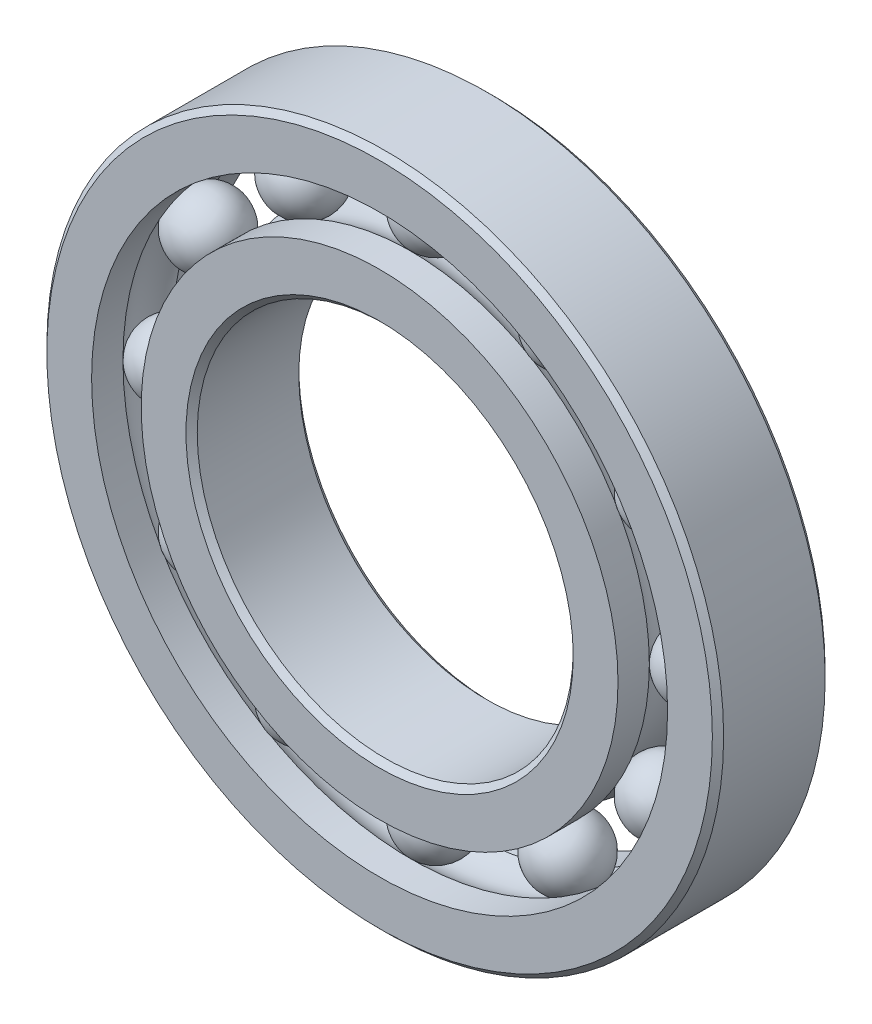
ISO-10303-21;
HEADER;
FILE_DESCRIPTION(('STEP AP214'),'2;1');
FILE_NAME('part.step','',(''),(''),'','','');
FILE_SCHEMA(('AUTOMOTIVE_DESIGN { 1 0 10303 214 1 1 1 1 }'));
ENDSEC;
DATA;
#1=APPLICATION_CONTEXT('core data for automotive mechanical design processes');
#2=APPLICATION_PROTOCOL_DEFINITION('international standard','automotive_design',2000,#1);
#3=PRODUCT_CONTEXT('',#1,'mechanical');
#4=PRODUCT('Part','Part','',(#3));
#5=PRODUCT_RELATED_PRODUCT_CATEGORY('part','',(#4));
#6=PRODUCT_DEFINITION_FORMATION('','',#4);
#7=PRODUCT_DEFINITION_CONTEXT('part definition',#1,'design');
#8=PRODUCT_DEFINITION('design','',#6,#7);
#9=PRODUCT_DEFINITION_SHAPE('','',#8);
#10=(LENGTH_UNIT() NAMED_UNIT(*) SI_UNIT(.MILLI.,.METRE.));
#11=(NAMED_UNIT(*) PLANE_ANGLE_UNIT() SI_UNIT($,.RADIAN.));
#12=(NAMED_UNIT(*) SI_UNIT($,.STERADIAN.) SOLID_ANGLE_UNIT());
#13=UNCERTAINTY_MEASURE_WITH_UNIT(LENGTH_MEASURE(1.E-05),#10,'distance_accuracy_value','');
#14=(GEOMETRIC_REPRESENTATION_CONTEXT(3) GLOBAL_UNCERTAINTY_ASSIGNED_CONTEXT((#13)) GLOBAL_UNIT_ASSIGNED_CONTEXT((#10,
#11,#12)) REPRESENTATION_CONTEXT('',''));
#15=CARTESIAN_POINT('',(0.,0.,0.));
#16=DIRECTION('',(0.,0.,1.));
#17=DIRECTION('',(1.,0.,0.));
#18=AXIS2_PLACEMENT_3D('',#15,#16,#17);
#19=CARTESIAN_POINT('',(-11.1124999999998,19.2474145991093,0.));
#20=DIRECTION('',(0.,0.,1.));
#21=DIRECTION('',(-0.499999999999989,0.866025403784445,0.));
#22=AXIS2_PLACEMENT_3D('',#19,#20,#21);
#23=SPHERICAL_SURFACE('',#22,2.97701678582704);
#24=CARTESIAN_POINT('',(-11.1124999999998,19.2474145991093,2.97701678582704));
#25=VERTEX_POINT('',#24);
#26=VERTEX_LOOP('',#25);
#27=FACE_BOUND('',#26,.T.);
#28=ADVANCED_FACE('F37',(#27),#23,.T.);
#29=CLOSED_SHELL('',(#28));
#30=MANIFOLD_SOLID_BREP('B2',#29);
#31=CARTESIAN_POINT('',(-19.247414599109,11.1125000000002,0.));
#32=DIRECTION('',(0.,0.,1.));
#33=DIRECTION('',(-0.866025403784433,0.50000000000001,0.));
#34=AXIS2_PLACEMENT_3D('',#31,#32,#33);
#35=SPHERICAL_SURFACE('',#34,2.97701678582704);
#36=CARTESIAN_POINT('',(-19.247414599109,11.1125000000002,2.97701678582704));
#37=VERTEX_POINT('',#36);
#38=VERTEX_LOOP('',#37);
#39=FACE_BOUND('',#38,.T.);
#40=ADVANCED_FACE('F57',(#39),#35,.T.);
#41=CLOSED_SHELL('',(#40));
#42=MANIFOLD_SOLID_BREP('B6',#41);
#43=CARTESIAN_POINT('',(-22.225,2.32794518267366E-13,0.));
#44=DIRECTION('',(0.,0.,1.));
#45=DIRECTION('',(-1.,0.,0.));
#46=AXIS2_PLACEMENT_3D('',#43,#44,#45);
#47=SPHERICAL_SURFACE('',#46,2.97701678582704);
#48=CARTESIAN_POINT('',(-22.225,2.32794518267366E-13,2.97701678582704));
#49=VERTEX_POINT('',#48);
#50=VERTEX_LOOP('',#49);
#51=FACE_BOUND('',#50,.T.);
#52=ADVANCED_FACE('F77',(#51),#47,.T.);
#53=CLOSED_SHELL('',(#52));
#54=MANIFOLD_SOLID_BREP('B33',#53);
#55=CARTESIAN_POINT('',(-19.2474145991093,-11.1124999999998,0.));
#56=DIRECTION('',(0.,0.,1.));
#57=DIRECTION('',(-0.866025403784443,-0.499999999999992,0.));
#58=AXIS2_PLACEMENT_3D('',#55,#56,#57);
#59=SPHERICAL_SURFACE('',#58,2.97701678582704);
#60=CARTESIAN_POINT('',(-19.2474145991093,-11.1124999999998,2.97701678582704));
#61=VERTEX_POINT('',#60);
#62=VERTEX_LOOP('',#61);
#63=FACE_BOUND('',#62,.T.);
#64=ADVANCED_FACE('F97',(#63),#59,.T.);
#65=CLOSED_SHELL('',(#64));
#66=MANIFOLD_SOLID_BREP('B53',#65);
#67=CARTESIAN_POINT('',(-11.1125000000002,-19.2474145991091,0.));
#68=DIRECTION('',(0.,0.,1.));
#69=DIRECTION('',(-0.500000000000007,-0.866025403784435,0.));
#70=AXIS2_PLACEMENT_3D('',#67,#68,#69);
#71=SPHERICAL_SURFACE('',#70,2.97701678582704);
#72=CARTESIAN_POINT('',(-11.1125000000002,-19.2474145991091,2.97701678582704));
#73=VERTEX_POINT('',#72);
#74=VERTEX_LOOP('',#73);
#75=FACE_BOUND('',#74,.T.);
#76=ADVANCED_FACE('F117',(#75),#71,.T.);
#77=CLOSED_SHELL('',(#76));
#78=MANIFOLD_SOLID_BREP('B73',#77);
#79=CARTESIAN_POINT('',(-1.55196345511577E-13,-22.225,0.));
#80=DIRECTION('',(0.,0.,1.));
#81=DIRECTION('',(0.,-1.,0.));
#82=AXIS2_PLACEMENT_3D('',#79,#80,#81);
#83=SPHERICAL_SURFACE('',#82,2.97701678582704);
#84=CARTESIAN_POINT('',(-1.55196345511577E-13,-22.225,2.97701678582704));
#85=VERTEX_POINT('',#84);
#86=VERTEX_LOOP('',#85);
#87=FACE_BOUND('',#86,.T.);
#88=ADVANCED_FACE('F137',(#87),#83,.T.);
#89=CLOSED_SHELL('',(#88));
#90=MANIFOLD_SOLID_BREP('B93',#89);
#91=CARTESIAN_POINT('',(11.1124999999999,-19.2474145991092,0.));
#92=DIRECTION('',(0.,0.,1.));
#93=DIRECTION('',(0.499999999999995,-0.866025403784442,0.));
#94=AXIS2_PLACEMENT_3D('',#91,#92,#93);
#95=SPHERICAL_SURFACE('',#94,2.97701678582704);
#96=CARTESIAN_POINT('',(11.1124999999999,-19.2474145991092,2.97701678582704));
#97=VERTEX_POINT('',#96);
#98=VERTEX_LOOP('',#97);
#99=FACE_BOUND('',#98,.T.);
#100=ADVANCED_FACE('F157',(#99),#95,.T.);
#101=CLOSED_SHELL('',(#100));
#102=MANIFOLD_SOLID_BREP('B113',#101);
#103=CARTESIAN_POINT('',(19.2474145991091,-11.1125000000001,0.));
#104=DIRECTION('',(0.,0.,1.));
#105=DIRECTION('',(0.866025403784436,-0.500000000000004,0.));
#106=AXIS2_PLACEMENT_3D('',#103,#104,#105);
#107=SPHERICAL_SURFACE('',#106,2.97701678582704);
#108=CARTESIAN_POINT('',(19.2474145991091,-11.1125000000001,2.97701678582704));
#109=VERTEX_POINT('',#108);
#110=VERTEX_LOOP('',#109);
#111=FACE_BOUND('',#110,.T.);
#112=ADVANCED_FACE('F177',(#111),#107,.T.);
#113=CLOSED_SHELL('',(#112));
#114=MANIFOLD_SOLID_BREP('B133',#113);
#115=CARTESIAN_POINT('',(22.225,0.,0.));
#116=DIRECTION('',(0.,0.,1.));
#117=DIRECTION('',(1.,0.,0.));
#118=AXIS2_PLACEMENT_3D('',#115,#116,#117);
#119=SPHERICAL_SURFACE('',#118,2.97701678582704);
#120=CARTESIAN_POINT('',(22.225,0.,2.97701678582704));
#121=VERTEX_POINT('',#120);
#122=VERTEX_LOOP('',#121);
#123=FACE_BOUND('',#122,.T.);
#124=ADVANCED_FACE('F197',(#123),#119,.T.);
#125=CLOSED_SHELL('',(#124));
#126=MANIFOLD_SOLID_BREP('B153',#125);
#127=CARTESIAN_POINT('',(19.2474145991092,11.1125,0.));
#128=DIRECTION('',(0.,0.,1.));
#129=DIRECTION('',(0.86602540378444,0.499999999999998,0.));
#130=AXIS2_PLACEMENT_3D('',#127,#128,#129);
#131=SPHERICAL_SURFACE('',#130,2.97701678582704);
#132=CARTESIAN_POINT('',(19.2474145991092,11.1125,2.97701678582704));
#133=VERTEX_POINT('',#132);
#134=VERTEX_LOOP('',#133);
#135=FACE_BOUND('',#134,.T.);
#136=ADVANCED_FACE('F217',(#135),#131,.T.);
#137=CLOSED_SHELL('',(#136));
#138=MANIFOLD_SOLID_BREP('B173',#137);
#139=CARTESIAN_POINT('',(11.1125,19.2474145991091,0.));
#140=DIRECTION('',(0.,0.,1.));
#141=DIRECTION('',(0.500000000000001,0.866025403784438,0.));
#142=AXIS2_PLACEMENT_3D('',#139,#140,#141);
#143=SPHERICAL_SURFACE('',#142,2.97701678582704);
#144=CARTESIAN_POINT('',(11.1125,19.2474145991091,2.97701678582704));
#145=VERTEX_POINT('',#144);
#146=VERTEX_LOOP('',#145);
#147=FACE_BOUND('',#146,.T.);
#148=ADVANCED_FACE('F237',(#147),#143,.T.);
#149=CLOSED_SHELL('',(#148));
#150=MANIFOLD_SOLID_BREP('B193',#149);
#151=CARTESIAN_POINT('',(0.,22.225,0.));
#152=DIRECTION('',(0.,0.,1.));
#153=DIRECTION('',(0.,1.,0.));
#154=AXIS2_PLACEMENT_3D('',#151,#152,#153);
#155=SPHERICAL_SURFACE('',#154,2.97701678582704);
#156=CARTESIAN_POINT('',(0.,22.225,2.97701678582704));
#157=VERTEX_POINT('',#156);
#158=VERTEX_LOOP('',#157);
#159=FACE_BOUND('',#158,.T.);
#160=ADVANCED_FACE('F259',(#159),#155,.T.);
#161=CLOSED_SHELL('',(#160));
#162=MANIFOLD_SOLID_BREP('B213',#161);
#163=CARTESIAN_POINT('',(0.,20.1315934065934,4.7625));
#164=DIRECTION('',(0.,0.,-1.));
#165=DIRECTION('',(-1.,0.,0.));
#166=AXIS2_PLACEMENT_3D('',#163,#164,#165);
#167=PLANE('',#166);
#168=CARTESIAN_POINT('',(0.,0.,4.7625));
#169=DIRECTION('',(0.,0.,1.));
#170=DIRECTION('',(1.,0.,0.));
#171=AXIS2_PLACEMENT_3D('',#168,#169,#170);
#172=CIRCLE('',#171,16.35125);
#173=CARTESIAN_POINT('',(16.35125,0.,4.7625));
#174=VERTEX_POINT('',#173);
#175=EDGE_CURVE('E306',#174,#174,#172,.T.);
#176=ORIENTED_EDGE('',*,*,#175,.F.);
#177=EDGE_LOOP('',(#176));
#178=FACE_BOUND('',#177,.T.);
#179=CARTESIAN_POINT('',(0.,0.,4.76250000000001));
#180=DIRECTION('',(0.,0.,1.));
#181=DIRECTION('',(1.,0.,0.));
#182=AXIS2_PLACEMENT_3D('',#179,#180,#181);
#183=CIRCLE('',#182,20.1315934065934);
#184=CARTESIAN_POINT('',(20.1315934065934,0.,4.76250000000001));
#185=VERTEX_POINT('',#184);
#186=EDGE_CURVE('E258',#185,#185,#183,.T.);
#187=ORIENTED_EDGE('',*,*,#186,.T.);
#188=EDGE_LOOP('',(#187));
#189=FACE_BOUND('',#188,.T.);
#190=ADVANCED_FACE('F278',(#178,#189),#167,.F.);
#191=CARTESIAN_POINT('',(0.,0.,4.7625));
#192=DIRECTION('',(0.,0.,1.));
#193=DIRECTION('',(1.,0.,0.));
#194=AXIS2_PLACEMENT_3D('',#191,#192,#193);
#195=CYLINDRICAL_SURFACE('',#194,20.1315934065934);
#196=ORIENTED_EDGE('',*,*,#186,.F.);
#197=EDGE_LOOP('',(#196));
#198=FACE_BOUND('',#197,.T.);
#199=CARTESIAN_POINT('',(0.,0.,2.11666666666667));
#200=DIRECTION('',(0.,0.,1.));
#201=DIRECTION('',(1.,0.,0.));
#202=AXIS2_PLACEMENT_3D('',#199,#200,#201);
#203=CIRCLE('',#202,20.1315934065934);
#204=CARTESIAN_POINT('',(20.1315934065934,0.,2.11666666666667));
#205=VERTEX_POINT('',#204);
#206=EDGE_CURVE('E284',#205,#205,#203,.T.);
#207=ORIENTED_EDGE('',*,*,#206,.T.);
#208=EDGE_LOOP('',(#207));
#209=FACE_BOUND('',#208,.T.);
#210=ADVANCED_FACE('F313',(#198,#209),#195,.T.);
#211=CARTESIAN_POINT('',(0.,0.,0.));
#212=DIRECTION('',(0.,0.,1.));
#213=DIRECTION('',(1.,0.,0.));
#214=AXIS2_PLACEMENT_3D('',#211,#212,#213);
#215=TOROIDAL_SURFACE('',#214,22.225,2.97701678582704);
#216=ORIENTED_EDGE('',*,*,#206,.F.);
#217=EDGE_LOOP('',(#216));
#218=FACE_BOUND('',#217,.T.);
#219=CARTESIAN_POINT('',(0.,0.,-2.11666666666667));
#220=DIRECTION('',(0.,0.,1.));
#221=DIRECTION('',(1.,0.,0.));
#222=AXIS2_PLACEMENT_3D('',#219,#220,#221);
#223=CIRCLE('',#222,20.1315934065934);
#224=CARTESIAN_POINT('',(20.1315934065934,0.,-2.11666666666667));
#225=VERTEX_POINT('',#224);
#226=EDGE_CURVE('E288',#225,#225,#223,.T.);
#227=ORIENTED_EDGE('',*,*,#226,.T.);
#228=EDGE_LOOP('',(#227));
#229=FACE_BOUND('',#228,.T.);
#230=ADVANCED_FACE('F317',(#218,#229),#215,.F.);
#231=CARTESIAN_POINT('',(0.,0.,4.7625));
#232=DIRECTION('',(0.,0.,1.));
#233=DIRECTION('',(1.,0.,0.));
#234=AXIS2_PLACEMENT_3D('',#231,#232,#233);
#235=CYLINDRICAL_SURFACE('',#234,20.1315934065934);
#236=ORIENTED_EDGE('',*,*,#226,.F.);
#237=EDGE_LOOP('',(#236));
#238=FACE_BOUND('',#237,.T.);
#239=CARTESIAN_POINT('',(0.,0.,-4.76250000000001));
#240=DIRECTION('',(0.,0.,1.));
#241=DIRECTION('',(1.,0.,0.));
#242=AXIS2_PLACEMENT_3D('',#239,#240,#241);
#243=CIRCLE('',#242,20.1315934065934);
#244=CARTESIAN_POINT('',(20.1315934065934,0.,-4.76250000000001));
#245=VERTEX_POINT('',#244);
#246=EDGE_CURVE('E292',#245,#245,#243,.T.);
#247=ORIENTED_EDGE('',*,*,#246,.T.);
#248=EDGE_LOOP('',(#247));
#249=FACE_BOUND('',#248,.T.);
#250=ADVANCED_FACE('F322',(#238,#249),#235,.T.);
#251=CARTESIAN_POINT('',(0.,16.35125,-4.7625));
#252=DIRECTION('',(0.,0.,1.));
#253=DIRECTION('',(1.,0.,0.));
#254=AXIS2_PLACEMENT_3D('',#251,#252,#253);
#255=PLANE('',#254);
#256=ORIENTED_EDGE('',*,*,#246,.F.);
#257=EDGE_LOOP('',(#256));
#258=FACE_BOUND('',#257,.T.);
#259=CARTESIAN_POINT('',(0.,0.,-4.7625));
#260=DIRECTION('',(0.,0.,1.));
#261=DIRECTION('',(1.,0.,0.));
#262=AXIS2_PLACEMENT_3D('',#259,#260,#261);
#263=CIRCLE('',#262,16.35125);
#264=CARTESIAN_POINT('',(16.35125,0.,-4.7625));
#265=VERTEX_POINT('',#264);
#266=EDGE_CURVE('E297',#265,#265,#263,.T.);
#267=ORIENTED_EDGE('',*,*,#266,.T.);
#268=EDGE_LOOP('',(#267));
#269=FACE_BOUND('',#268,.T.);
#270=ADVANCED_FACE('F328',(#258,#269),#255,.F.);
#271=CARTESIAN_POINT('',(0.,0.,-4.28625));
#272=DIRECTION('',(0.,0.,-1.));
#273=DIRECTION('',(-1.,0.,0.));
#274=AXIS2_PLACEMENT_3D('',#271,#272,#273);
#275=CONICAL_SURFACE('',#274,15.875,0.785398163397447);
#276=ORIENTED_EDGE('',*,*,#266,.F.);
#277=EDGE_LOOP('',(#276));
#278=FACE_BOUND('',#277,.T.);
#279=CARTESIAN_POINT('',(0.,0.,-4.28625));
#280=DIRECTION('',(0.,0.,1.));
#281=DIRECTION('',(1.,0.,0.));
#282=AXIS2_PLACEMENT_3D('',#279,#280,#281);
#283=CIRCLE('',#282,15.875);
#284=CARTESIAN_POINT('',(15.875,0.,-4.28625));
#285=VERTEX_POINT('',#284);
#286=EDGE_CURVE('E300',#285,#285,#283,.T.);
#287=ORIENTED_EDGE('',*,*,#286,.T.);
#288=EDGE_LOOP('',(#287));
#289=FACE_BOUND('',#288,.T.);
#290=ADVANCED_FACE('F332',(#278,#289),#275,.F.);
#291=CARTESIAN_POINT('',(0.,0.,4.7625));
#292=DIRECTION('',(0.,0.,1.));
#293=DIRECTION('',(1.,0.,0.));
#294=AXIS2_PLACEMENT_3D('',#291,#292,#293);
#295=CYLINDRICAL_SURFACE('',#294,15.875);
#296=ORIENTED_EDGE('',*,*,#286,.F.);
#297=EDGE_LOOP('',(#296));
#298=FACE_BOUND('',#297,.T.);
#299=CARTESIAN_POINT('',(0.,0.,4.28625000000001));
#300=DIRECTION('',(0.,0.,1.));
#301=DIRECTION('',(1.,0.,0.));
#302=AXIS2_PLACEMENT_3D('',#299,#300,#301);
#303=CIRCLE('',#302,15.875);
#304=CARTESIAN_POINT('',(15.875,0.,4.28625000000001));
#305=VERTEX_POINT('',#304);
#306=EDGE_CURVE('E303',#305,#305,#303,.T.);
#307=ORIENTED_EDGE('',*,*,#306,.T.);
#308=EDGE_LOOP('',(#307));
#309=FACE_BOUND('',#308,.T.);
#310=ADVANCED_FACE('F336',(#298,#309),#295,.F.);
#311=CARTESIAN_POINT('',(0.,0.,4.7625));
#312=DIRECTION('',(0.,0.,1.));
#313=DIRECTION('',(1.,0.,0.));
#314=AXIS2_PLACEMENT_3D('',#311,#312,#313);
#315=CONICAL_SURFACE('',#314,16.35125,0.785398163397448);
#316=ORIENTED_EDGE('',*,*,#306,.F.);
#317=EDGE_LOOP('',(#316));
#318=FACE_BOUND('',#317,.T.);
#319=ORIENTED_EDGE('',*,*,#175,.T.);
#320=EDGE_LOOP('',(#319));
#321=FACE_BOUND('',#320,.T.);
#322=ADVANCED_FACE('F310',(#318,#321),#315,.F.);
#323=CLOSED_SHELL('',(#190,#210,#230,#250,#270,#290,#310,#322));
#324=MANIFOLD_SOLID_BREP('B233',#323);
#325=CARTESIAN_POINT('',(0.,0.,4.28625));
#326=DIRECTION('',(0.,0.,-1.));
#327=DIRECTION('',(-1.,0.,0.));
#328=AXIS2_PLACEMENT_3D('',#325,#326,#327);
#329=CONICAL_SURFACE('',#328,28.575,0.785398163397446);
#330=CARTESIAN_POINT('',(0.,0.,4.7625));
#331=DIRECTION('',(0.,0.,1.));
#332=DIRECTION('',(1.,0.,0.));
#333=AXIS2_PLACEMENT_3D('',#330,#331,#332);
#334=CIRCLE('',#333,28.09875);
#335=CARTESIAN_POINT('',(28.09875,0.,4.7625));
#336=VERTEX_POINT('',#335);
#337=EDGE_CURVE('E427',#336,#336,#334,.T.);
#338=ORIENTED_EDGE('',*,*,#337,.F.);
#339=EDGE_LOOP('',(#338));
#340=FACE_BOUND('',#339,.T.);
#341=CARTESIAN_POINT('',(0.,0.,4.28625));
#342=DIRECTION('',(0.,0.,1.));
#343=DIRECTION('',(1.,0.,0.));
#344=AXIS2_PLACEMENT_3D('',#341,#342,#343);
#345=CIRCLE('',#344,28.575);
#346=CARTESIAN_POINT('',(28.575,0.,4.28625));
#347=VERTEX_POINT('',#346);
#348=EDGE_CURVE('E277',#347,#347,#345,.T.);
#349=ORIENTED_EDGE('',*,*,#348,.T.);
#350=EDGE_LOOP('',(#349));
#351=FACE_BOUND('',#350,.T.);
#352=ADVANCED_FACE('F399',(#340,#351),#329,.T.);
#353=CARTESIAN_POINT('',(0.,0.,4.7625));
#354=DIRECTION('',(0.,0.,1.));
#355=DIRECTION('',(1.,0.,0.));
#356=AXIS2_PLACEMENT_3D('',#353,#354,#355);
#357=CYLINDRICAL_SURFACE('',#356,28.575);
#358=ORIENTED_EDGE('',*,*,#348,.F.);
#359=EDGE_LOOP('',(#358));
#360=FACE_BOUND('',#359,.T.);
#361=CARTESIAN_POINT('',(0.,0.,-4.28625));
#362=DIRECTION('',(0.,0.,1.));
#363=DIRECTION('',(1.,0.,0.));
#364=AXIS2_PLACEMENT_3D('',#361,#362,#363);
#365=CIRCLE('',#364,28.575);
#366=CARTESIAN_POINT('',(28.575,0.,-4.28625));
#367=VERTEX_POINT('',#366);
#368=EDGE_CURVE('E405',#367,#367,#365,.T.);
#369=ORIENTED_EDGE('',*,*,#368,.T.);
#370=EDGE_LOOP('',(#369));
#371=FACE_BOUND('',#370,.T.);
#372=ADVANCED_FACE('F434',(#360,#371),#357,.T.);
#373=CARTESIAN_POINT('',(0.,0.,-4.7625));
#374=DIRECTION('',(0.,0.,1.));
#375=DIRECTION('',(1.,0.,0.));
#376=AXIS2_PLACEMENT_3D('',#373,#374,#375);
#377=CONICAL_SURFACE('',#376,28.09875,0.785398163397447);
#378=ORIENTED_EDGE('',*,*,#368,.F.);
#379=EDGE_LOOP('',(#378));
#380=FACE_BOUND('',#379,.T.);
#381=CARTESIAN_POINT('',(0.,0.,-4.7625));
#382=DIRECTION('',(0.,0.,1.));
#383=DIRECTION('',(1.,0.,0.));
#384=AXIS2_PLACEMENT_3D('',#381,#382,#383);
#385=CIRCLE('',#384,28.09875);
#386=CARTESIAN_POINT('',(28.09875,0.,-4.7625));
#387=VERTEX_POINT('',#386);
#388=EDGE_CURVE('E409',#387,#387,#385,.T.);
#389=ORIENTED_EDGE('',*,*,#388,.T.);
#390=EDGE_LOOP('',(#389));
#391=FACE_BOUND('',#390,.T.);
#392=ADVANCED_FACE('F438',(#380,#391),#377,.T.);
#393=CARTESIAN_POINT('',(0.,28.09875,-4.7625));
#394=DIRECTION('',(0.,0.,1.));
#395=DIRECTION('',(1.,0.,0.));
#396=AXIS2_PLACEMENT_3D('',#393,#394,#395);
#397=PLANE('',#396);
#398=ORIENTED_EDGE('',*,*,#388,.F.);
#399=EDGE_LOOP('',(#398));
#400=FACE_BOUND('',#399,.T.);
#401=CARTESIAN_POINT('',(0.,0.,-4.7625));
#402=DIRECTION('',(0.,0.,1.));
#403=DIRECTION('',(1.,0.,0.));
#404=AXIS2_PLACEMENT_3D('',#401,#402,#403);
#405=CIRCLE('',#404,24.3184065934066);
#406=CARTESIAN_POINT('',(24.3184065934066,0.,-4.7625));
#407=VERTEX_POINT('',#406);
#408=EDGE_CURVE('E413',#407,#407,#405,.T.);
#409=ORIENTED_EDGE('',*,*,#408,.T.);
#410=EDGE_LOOP('',(#409));
#411=FACE_BOUND('',#410,.T.);
#412=ADVANCED_FACE('F443',(#400,#411),#397,.F.);
#413=CARTESIAN_POINT('',(0.,0.,4.7625));
#414=DIRECTION('',(0.,0.,1.));
#415=DIRECTION('',(1.,0.,0.));
#416=AXIS2_PLACEMENT_3D('',#413,#414,#415);
#417=CYLINDRICAL_SURFACE('',#416,24.3184065934066);
#418=ORIENTED_EDGE('',*,*,#408,.F.);
#419=EDGE_LOOP('',(#418));
#420=FACE_BOUND('',#419,.T.);
#421=CARTESIAN_POINT('',(0.,0.,-2.11666666666667));
#422=DIRECTION('',(0.,0.,1.));
#423=DIRECTION('',(1.,0.,0.));
#424=AXIS2_PLACEMENT_3D('',#421,#422,#423);
#425=CIRCLE('',#424,24.3184065934066);
#426=CARTESIAN_POINT('',(24.3184065934066,0.,-2.11666666666667));
#427=VERTEX_POINT('',#426);
#428=EDGE_CURVE('E418',#427,#427,#425,.T.);
#429=ORIENTED_EDGE('',*,*,#428,.T.);
#430=EDGE_LOOP('',(#429));
#431=FACE_BOUND('',#430,.T.);
#432=ADVANCED_FACE('F449',(#420,#431),#417,.F.);
#433=CARTESIAN_POINT('',(0.,0.,0.));
#434=DIRECTION('',(0.,0.,1.));
#435=DIRECTION('',(1.,0.,0.));
#436=AXIS2_PLACEMENT_3D('',#433,#434,#435);
#437=TOROIDAL_SURFACE('',#436,22.225,2.97701678582704);
#438=ORIENTED_EDGE('',*,*,#428,.F.);
#439=EDGE_LOOP('',(#438));
#440=FACE_BOUND('',#439,.T.);
#441=CARTESIAN_POINT('',(0.,0.,2.11666666666667));
#442=DIRECTION('',(0.,0.,1.));
#443=DIRECTION('',(1.,0.,0.));
#444=AXIS2_PLACEMENT_3D('',#441,#442,#443);
#445=CIRCLE('',#444,24.3184065934066);
#446=CARTESIAN_POINT('',(24.3184065934066,0.,2.11666666666667));
#447=VERTEX_POINT('',#446);
#448=EDGE_CURVE('E421',#447,#447,#445,.T.);
#449=ORIENTED_EDGE('',*,*,#448,.T.);
#450=EDGE_LOOP('',(#449));
#451=FACE_BOUND('',#450,.T.);
#452=ADVANCED_FACE('F453',(#440,#451),#437,.F.);
#453=CARTESIAN_POINT('',(0.,0.,4.7625));
#454=DIRECTION('',(0.,0.,1.));
#455=DIRECTION('',(1.,0.,0.));
#456=AXIS2_PLACEMENT_3D('',#453,#454,#455);
#457=CYLINDRICAL_SURFACE('',#456,24.3184065934066);
#458=ORIENTED_EDGE('',*,*,#448,.F.);
#459=EDGE_LOOP('',(#458));
#460=FACE_BOUND('',#459,.T.);
#461=CARTESIAN_POINT('',(0.,0.,4.7625));
#462=DIRECTION('',(0.,0.,1.));
#463=DIRECTION('',(1.,0.,0.));
#464=AXIS2_PLACEMENT_3D('',#461,#462,#463);
#465=CIRCLE('',#464,24.3184065934066);
#466=CARTESIAN_POINT('',(24.3184065934066,0.,4.7625));
#467=VERTEX_POINT('',#466);
#468=EDGE_CURVE('E424',#467,#467,#465,.T.);
#469=ORIENTED_EDGE('',*,*,#468,.T.);
#470=EDGE_LOOP('',(#469));
#471=FACE_BOUND('',#470,.T.);
#472=ADVANCED_FACE('F457',(#460,#471),#457,.F.);
#473=CARTESIAN_POINT('',(0.,28.09875,4.7625));
#474=DIRECTION('',(0.,0.,-1.));
#475=DIRECTION('',(-1.,0.,0.));
#476=AXIS2_PLACEMENT_3D('',#473,#474,#475);
#477=PLANE('',#476);
#478=ORIENTED_EDGE('',*,*,#468,.F.);
#479=EDGE_LOOP('',(#478));
#480=FACE_BOUND('',#479,.T.);
#481=ORIENTED_EDGE('',*,*,#337,.T.);
#482=EDGE_LOOP('',(#481));
#483=FACE_BOUND('',#482,.T.);
#484=ADVANCED_FACE('F431',(#480,#483),#477,.F.);
#485=CLOSED_SHELL('',(#352,#372,#392,#412,#432,#452,#472,#484));
#486=MANIFOLD_SOLID_BREP('B253',#485);
#487=ADVANCED_BREP_SHAPE_REPRESENTATION('',(#18,#30,#42,#54,#66,#78,#90,#102,#114,#126,#138,
#150,#162,#324,#486),#14);
#488=SHAPE_DEFINITION_REPRESENTATION(#9,#487);
ENDSEC;
END-ISO-10303-21;
